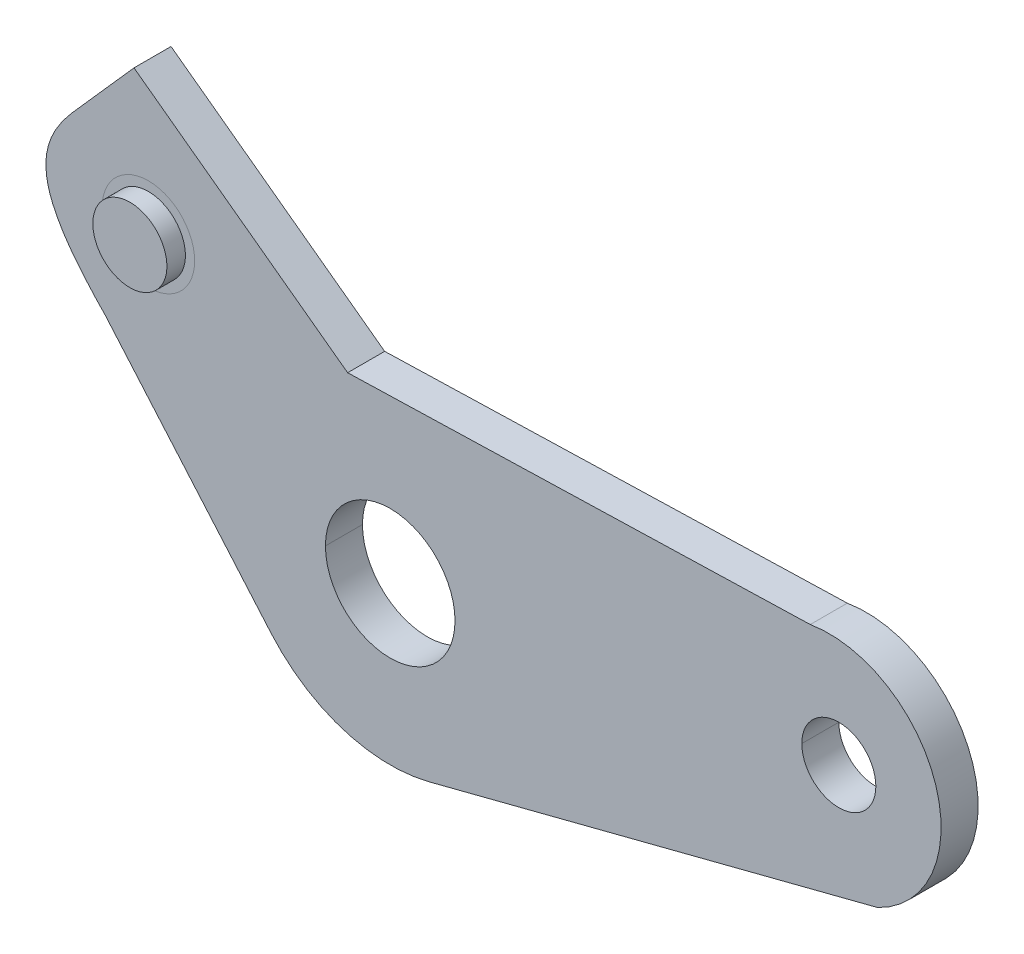
ISO-10303-21;
HEADER;
FILE_DESCRIPTION(('STEP AP214'),'2;1');
FILE_NAME('part.step','',(''),(''),'','','');
FILE_SCHEMA(('AUTOMOTIVE_DESIGN { 1 0 10303 214 1 1 1 1 }'));
ENDSEC;
DATA;
#1=APPLICATION_CONTEXT('core data for automotive mechanical design processes');
#2=APPLICATION_PROTOCOL_DEFINITION('international standard','automotive_design',2000,#1);
#3=PRODUCT_CONTEXT('',#1,'mechanical');
#4=PRODUCT('Part','Part','',(#3));
#5=PRODUCT_RELATED_PRODUCT_CATEGORY('part','',(#4));
#6=PRODUCT_DEFINITION_FORMATION('','',#4);
#7=PRODUCT_DEFINITION_CONTEXT('part definition',#1,'design');
#8=PRODUCT_DEFINITION('design','',#6,#7);
#9=PRODUCT_DEFINITION_SHAPE('','',#8);
#10=(LENGTH_UNIT() NAMED_UNIT(*) SI_UNIT(.MILLI.,.METRE.));
#11=(NAMED_UNIT(*) PLANE_ANGLE_UNIT() SI_UNIT($,.RADIAN.));
#12=(NAMED_UNIT(*) SI_UNIT($,.STERADIAN.) SOLID_ANGLE_UNIT());
#13=UNCERTAINTY_MEASURE_WITH_UNIT(LENGTH_MEASURE(1.E-05),#10,'distance_accuracy_value','');
#14=(GEOMETRIC_REPRESENTATION_CONTEXT(3) GLOBAL_UNCERTAINTY_ASSIGNED_CONTEXT((#13)) GLOBAL_UNIT_ASSIGNED_CONTEXT((#10,
#11,#12)) REPRESENTATION_CONTEXT('',''));
#15=CARTESIAN_POINT('',(0.,0.,0.));
#16=DIRECTION('',(0.,0.,1.));
#17=DIRECTION('',(1.,0.,0.));
#18=AXIS2_PLACEMENT_3D('',#15,#16,#17);
#19=CARTESIAN_POINT('',(-4.59610422628045,7.63971387845278,-2.));
#20=DIRECTION('',(0.,0.,1.));
#21=DIRECTION('',(1.,0.,0.));
#22=AXIS2_PLACEMENT_3D('',#19,#20,#21);
#23=PLANE('',#22);
#24=CARTESIAN_POINT('',(-4.59610422628045,7.63971387845278,-2.));
#25=DIRECTION('',(0.,0.,1.));
#26=DIRECTION('',(1.,0.,0.));
#27=AXIS2_PLACEMENT_3D('',#24,#25,#26);
#28=CIRCLE('',#27,2.5);
#29=CARTESIAN_POINT('',(-7.09610422628045,7.63971387845278,-2.));
#30=VERTEX_POINT('',#29);
#31=CARTESIAN_POINT('',(-2.09610422628045,7.63971387845278,-2.));
#32=VERTEX_POINT('',#31);
#33=EDGE_CURVE('P0_E54',#30,#32,#28,.T.);
#34=ORIENTED_EDGE('',*,*,#33,.F.);
#35=CARTESIAN_POINT('',(-4.59610422628045,7.63971387845278,-2.));
#36=DIRECTION('',(0.,0.,1.));
#37=DIRECTION('',(1.,0.,0.));
#38=AXIS2_PLACEMENT_3D('',#35,#36,#37);
#39=CIRCLE('',#38,2.5);
#40=EDGE_CURVE('P0_E86',#32,#30,#39,.T.);
#41=ORIENTED_EDGE('',*,*,#40,.F.);
#42=EDGE_LOOP('',(#34,#41));
#43=FACE_BOUND('',#42,.T.);
#44=ADVANCED_FACE('P0_F45',(#43),#23,.F.);
#45=CARTESIAN_POINT('',(-4.59610422628045,7.63971387845278,3.));
#46=DIRECTION('',(0.,0.,-1.));
#47=DIRECTION('',(-1.,0.,0.));
#48=AXIS2_PLACEMENT_3D('',#45,#46,#47);
#49=CYLINDRICAL_SURFACE('',#48,2.5);
#50=CARTESIAN_POINT('',(-4.59610422628045,7.63971387845278,2.));
#51=DIRECTION('',(0.,0.,-1.));
#52=DIRECTION('',(-1.,0.,0.));
#53=AXIS2_PLACEMENT_3D('',#50,#51,#52);
#54=CIRCLE('',#53,2.5);
#55=CARTESIAN_POINT('',(-7.09610422628045,7.63971387845278,2.));
#56=VERTEX_POINT('',#55);
#57=CARTESIAN_POINT('',(-2.09610422628045,7.63971387845278,2.));
#58=VERTEX_POINT('',#57);
#59=EDGE_CURVE('P0_E59',#56,#58,#54,.F.);
#60=ORIENTED_EDGE('',*,*,#59,.F.);
#61=DIRECTION('',(0.,0.,-1.));
#62=VECTOR('',#61,1.);
#63=CARTESIAN_POINT('',(-7.09610422628045,7.63971387845278,3.));
#64=LINE('',#63,#62);
#65=EDGE_CURVE('P0_E69',#56,#30,#64,.T.);
#66=ORIENTED_EDGE('',*,*,#65,.T.);
#67=ORIENTED_EDGE('',*,*,#33,.T.);
#68=DIRECTION('',(0.,0.,-1.));
#69=VECTOR('',#68,1.);
#70=CARTESIAN_POINT('',(-2.09610422628045,7.63971387845278,3.));
#71=LINE('',#70,#69);
#72=EDGE_CURVE('P0_E79',#58,#32,#71,.T.);
#73=ORIENTED_EDGE('',*,*,#72,.F.);
#74=EDGE_LOOP('',(#60,#66,#67,#73));
#75=FACE_BOUND('',#74,.T.);
#76=ADVANCED_FACE('P0_F47',(#75),#49,.T.);
#77=CARTESIAN_POINT('',(-4.59610422628045,7.63971387845278,3.));
#78=DIRECTION('',(0.,0.,-1.));
#79=DIRECTION('',(-1.,0.,0.));
#80=AXIS2_PLACEMENT_3D('',#77,#78,#79);
#81=CYLINDRICAL_SURFACE('',#80,2.5);
#82=CARTESIAN_POINT('',(-4.59610422628045,7.63971387845278,2.));
#83=DIRECTION('',(0.,0.,-1.));
#84=DIRECTION('',(-1.,0.,0.));
#85=AXIS2_PLACEMENT_3D('',#82,#83,#84);
#86=CIRCLE('',#85,2.5);
#87=EDGE_CURVE('P0_E11',#58,#56,#86,.F.);
#88=ORIENTED_EDGE('',*,*,#87,.F.);
#89=ORIENTED_EDGE('',*,*,#72,.T.);
#90=ORIENTED_EDGE('',*,*,#40,.T.);
#91=ORIENTED_EDGE('',*,*,#65,.F.);
#92=EDGE_LOOP('',(#88,#89,#90,#91));
#93=FACE_BOUND('',#92,.T.);
#94=ADVANCED_FACE('P0_F84',(#93),#81,.T.);
#95=CARTESIAN_POINT('',(-4.59610422628045,7.63971387845278,-7.59838450677923));
#96=DIRECTION('',(0.,0.,1.));
#97=DIRECTION('',(1.,0.,0.));
#98=AXIS2_PLACEMENT_3D('',#95,#96,#97);
#99=CYLINDRICAL_SURFACE('',#98,2.);
#100=CARTESIAN_POINT('',(-4.59610422628045,7.63971387845278,3.));
#101=DIRECTION('',(0.,0.,-1.));
#102=DIRECTION('',(-1.,0.,0.));
#103=AXIS2_PLACEMENT_3D('',#100,#101,#102);
#104=CIRCLE('',#103,2.);
#105=CARTESIAN_POINT('',(-6.59610422628045,7.63971387845278,3.));
#106=VERTEX_POINT('',#105);
#107=EDGE_CURVE('P0_E81',#106,#106,#104,.T.);
#108=ORIENTED_EDGE('',*,*,#107,.T.);
#109=EDGE_LOOP('',(#108));
#110=FACE_BOUND('',#109,.T.);
#111=CARTESIAN_POINT('',(-4.59610422628045,7.63971387845278,2.));
#112=DIRECTION('',(0.,0.,-1.));
#113=DIRECTION('',(-1.,0.,0.));
#114=AXIS2_PLACEMENT_3D('',#111,#112,#113);
#115=CIRCLE('',#114,2.);
#116=CARTESIAN_POINT('',(-6.59610422628045,7.63971387845278,2.));
#117=VERTEX_POINT('',#116);
#118=EDGE_CURVE('P0_E97',#117,#117,#115,.T.);
#119=ORIENTED_EDGE('',*,*,#118,.F.);
#120=EDGE_LOOP('',(#119));
#121=FACE_BOUND('',#120,.T.);
#122=ADVANCED_FACE('P0_F105',(#110,#121),#99,.T.);
#123=CARTESIAN_POINT('',(-10.0151184548294,7.22603500592955,2.));
#124=DIRECTION('',(0.,0.,-1.));
#125=DIRECTION('',(0.,-1.,0.));
#126=AXIS2_PLACEMENT_3D('',#123,#124,#125);
#127=PLANE('',#126);
#128=ORIENTED_EDGE('',*,*,#59,.T.);
#129=ORIENTED_EDGE('',*,*,#87,.T.);
#130=EDGE_LOOP('',(#128,#129));
#131=FACE_BOUND('',#130,.T.);
#132=ORIENTED_EDGE('',*,*,#118,.T.);
#133=EDGE_LOOP('',(#132));
#134=FACE_BOUND('',#133,.T.);
#135=ADVANCED_FACE('P0_F75',(#131,#134),#127,.F.);
#136=CARTESIAN_POINT('',(-4.59610422628045,7.63971387845278,3.));
#137=DIRECTION('',(0.,0.,1.));
#138=DIRECTION('',(1.,0.,0.));
#139=AXIS2_PLACEMENT_3D('',#136,#137,#138);
#140=PLANE('',#139);
#141=ORIENTED_EDGE('',*,*,#107,.F.);
#142=EDGE_LOOP('',(#141));
#143=FACE_BOUND('',#142,.T.);
#144=ADVANCED_FACE('P0_F108',(#143),#140,.T.);
#145=CLOSED_SHELL('',(#44,#76,#94,#122,#135,#144));
#146=MANIFOLD_SOLID_BREP('P0_B2',#145);
#147=CARTESIAN_POINT('',(-4.59610422628045,7.63971387845278,2.));
#148=DIRECTION('',(0.,0.,-1.));
#149=DIRECTION('',(-1.,0.,0.));
#150=AXIS2_PLACEMENT_3D('',#147,#148,#149);
#151=CYLINDRICAL_SURFACE('',#150,2.5);
#152=DIRECTION('',(0.,0.,-1.));
#153=VECTOR('',#152,1.);
#154=CARTESIAN_POINT('',(-2.09610422628045,7.63971387845278,2.));
#155=LINE('',#154,#153);
#156=CARTESIAN_POINT('',(-2.09610422628045,7.63971387845278,2.));
#157=VERTEX_POINT('',#156);
#158=CARTESIAN_POINT('',(-2.09610422628045,7.63971387845278,0.));
#159=VERTEX_POINT('',#158);
#160=EDGE_CURVE('P1_E277',#157,#159,#155,.T.);
#161=ORIENTED_EDGE('',*,*,#160,.F.);
#162=CARTESIAN_POINT('',(-4.59610422628045,7.63971387845278,2.));
#163=DIRECTION('',(0.,0.,1.));
#164=DIRECTION('',(1.,0.,0.));
#165=AXIS2_PLACEMENT_3D('',#162,#163,#164);
#166=CIRCLE('',#165,2.5);
#167=CARTESIAN_POINT('',(-7.09610422628045,7.63971387845278,2.));
#168=VERTEX_POINT('',#167);
#169=EDGE_CURVE('P1_E229',#157,#168,#166,.T.);
#170=ORIENTED_EDGE('',*,*,#169,.T.);
#171=DIRECTION('',(0.,0.,-1.));
#172=VECTOR('',#171,1.);
#173=CARTESIAN_POINT('',(-7.09610422628045,7.63971387845278,2.));
#174=LINE('',#173,#172);
#175=CARTESIAN_POINT('',(-7.09610422628045,7.63971387845278,0.));
#176=VERTEX_POINT('',#175);
#177=EDGE_CURVE('P1_E276',#168,#176,#174,.T.);
#178=ORIENTED_EDGE('',*,*,#177,.T.);
#179=CARTESIAN_POINT('',(-4.59610422628045,7.63971387845278,0.));
#180=DIRECTION('',(0.,0.,1.));
#181=DIRECTION('',(1.,0.,0.));
#182=AXIS2_PLACEMENT_3D('',#179,#180,#181);
#183=CIRCLE('',#182,2.5);
#184=EDGE_CURVE('P1_E269',#159,#176,#183,.T.);
#185=ORIENTED_EDGE('',*,*,#184,.F.);
#186=EDGE_LOOP('',(#161,#170,#178,#185));
#187=FACE_BOUND('',#186,.T.);
#188=ADVANCED_FACE('P1_F16',(#187),#151,.F.);
#189=CARTESIAN_POINT('',(8.46825121049389,-2.15939244083325,2.));
#190=DIRECTION('',(0.,0.,-1.));
#191=DIRECTION('',(-1.,0.,0.));
#192=AXIS2_PLACEMENT_3D('',#189,#190,#191);
#193=CYLINDRICAL_SURFACE('',#192,3.5);
#194=DIRECTION('',(0.,0.,-1.));
#195=VECTOR('',#194,1.);
#196=CARTESIAN_POINT('',(11.9682512104939,-2.15939244083325,2.));
#197=LINE('',#196,#195);
#198=CARTESIAN_POINT('',(11.9682512104939,-2.15939244083325,2.));
#199=VERTEX_POINT('',#198);
#200=CARTESIAN_POINT('',(11.9682512104939,-2.15939244083325,0.));
#201=VERTEX_POINT('',#200);
#202=EDGE_CURVE('P1_E197',#199,#201,#197,.T.);
#203=ORIENTED_EDGE('',*,*,#202,.F.);
#204=CARTESIAN_POINT('',(8.46825121049389,-2.15939244083325,2.));
#205=DIRECTION('',(0.,0.,1.));
#206=DIRECTION('',(1.,0.,0.));
#207=AXIS2_PLACEMENT_3D('',#204,#205,#206);
#208=CIRCLE('',#207,3.5);
#209=CARTESIAN_POINT('',(4.96825121049389,-2.15939244083325,2.));
#210=VERTEX_POINT('',#209);
#211=EDGE_CURVE('P1_E236',#199,#210,#208,.T.);
#212=ORIENTED_EDGE('',*,*,#211,.T.);
#213=DIRECTION('',(0.,0.,-1.));
#214=VECTOR('',#213,1.);
#215=CARTESIAN_POINT('',(4.9682512104939,-2.15939244083325,2.));
#216=LINE('',#215,#214);
#217=CARTESIAN_POINT('',(4.96825121049389,-2.15939244083325,0.));
#218=VERTEX_POINT('',#217);
#219=EDGE_CURVE('P1_E196',#210,#218,#216,.T.);
#220=ORIENTED_EDGE('',*,*,#219,.T.);
#221=CARTESIAN_POINT('',(8.46825121049389,-2.15939244083325,0.));
#222=DIRECTION('',(0.,0.,1.));
#223=DIRECTION('',(1.,0.,0.));
#224=AXIS2_PLACEMENT_3D('',#221,#222,#223);
#225=CIRCLE('',#224,3.5);
#226=EDGE_CURVE('P1_E204',#201,#218,#225,.T.);
#227=ORIENTED_EDGE('',*,*,#226,.F.);
#228=EDGE_LOOP('',(#203,#212,#220,#227));
#229=FACE_BOUND('',#228,.T.);
#230=ADVANCED_FACE('P1_F351',(#229),#193,.F.);
#231=CARTESIAN_POINT('',(32.6996319505323,1.4586439646349,2.));
#232=DIRECTION('',(0.,0.,-1.));
#233=DIRECTION('',(-1.,0.,0.));
#234=AXIS2_PLACEMENT_3D('',#231,#232,#233);
#235=CYLINDRICAL_SURFACE('',#234,2.);
#236=DIRECTION('',(0.,0.,-1.));
#237=VECTOR('',#236,1.);
#238=CARTESIAN_POINT('',(34.6996319505323,1.4586439646349,2.));
#239=LINE('',#238,#237);
#240=CARTESIAN_POINT('',(34.6996319505323,1.4586439646349,2.));
#241=VERTEX_POINT('',#240);
#242=CARTESIAN_POINT('',(34.6996319505323,1.4586439646349,0.));
#243=VERTEX_POINT('',#242);
#244=EDGE_CURVE('P1_E242',#241,#243,#239,.T.);
#245=ORIENTED_EDGE('',*,*,#244,.F.);
#246=CARTESIAN_POINT('',(32.6996319505323,1.4586439646349,2.));
#247=DIRECTION('',(0.,0.,1.));
#248=DIRECTION('',(1.,0.,0.));
#249=AXIS2_PLACEMENT_3D('',#246,#247,#248);
#250=CIRCLE('',#249,2.);
#251=CARTESIAN_POINT('',(30.6996319505323,1.4586439646349,2.));
#252=VERTEX_POINT('',#251);
#253=EDGE_CURVE('P1_E254',#241,#252,#250,.T.);
#254=ORIENTED_EDGE('',*,*,#253,.T.);
#255=DIRECTION('',(0.,0.,-1.));
#256=VECTOR('',#255,1.);
#257=CARTESIAN_POINT('',(30.6996319505323,1.4586439646349,2.));
#258=LINE('',#257,#256);
#259=CARTESIAN_POINT('',(30.6996319505323,1.4586439646349,0.));
#260=VERTEX_POINT('',#259);
#261=EDGE_CURVE('P1_E198',#252,#260,#258,.T.);
#262=ORIENTED_EDGE('',*,*,#261,.T.);
#263=CARTESIAN_POINT('',(32.6996319505323,1.4586439646349,0.));
#264=DIRECTION('',(0.,0.,1.));
#265=DIRECTION('',(1.,0.,0.));
#266=AXIS2_PLACEMENT_3D('',#263,#264,#265);
#267=CIRCLE('',#266,2.);
#268=EDGE_CURVE('P1_E207',#243,#260,#267,.T.);
#269=ORIENTED_EDGE('',*,*,#268,.F.);
#270=EDGE_LOOP('',(#245,#254,#262,#269));
#271=FACE_BOUND('',#270,.T.);
#272=ADVANCED_FACE('P1_F373',(#271),#235,.F.);
#273=CARTESIAN_POINT('',(6.16762100389155,6.5415902997811,2.));
#274=DIRECTION('',(0.0286182176784376,-0.999590414928489,0.));
#275=DIRECTION('',(0.,0.,-1.));
#276=AXIS2_PLACEMENT_3D('',#273,#274,#275);
#277=PLANE('',#276);
#278=DIRECTION('',(-0.999590414928489,-0.0286182176784376,0.));
#279=VECTOR('',#278,1.);
#280=CARTESIAN_POINT('',(6.16762100389155,6.5415902997811,0.));
#281=LINE('',#280,#279);
#282=CARTESIAN_POINT('',(31.1573813771038,7.25704574174204,0.));
#283=VERTEX_POINT('',#282);
#284=CARTESIAN_POINT('',(6.16762100389155,6.5415902997811,0.));
#285=VERTEX_POINT('',#284);
#286=EDGE_CURVE('P1_E187',#283,#285,#281,.T.);
#287=ORIENTED_EDGE('',*,*,#286,.T.);
#288=DIRECTION('',(0.,0.,-1.));
#289=VECTOR('',#288,1.);
#290=CARTESIAN_POINT('',(6.16762100389155,6.5415902997811,2.));
#291=LINE('',#290,#289);
#292=CARTESIAN_POINT('',(6.16762100389155,6.5415902997811,2.));
#293=VERTEX_POINT('',#292);
#294=EDGE_CURVE('P1_E223',#293,#285,#291,.T.);
#295=ORIENTED_EDGE('',*,*,#294,.F.);
#296=DIRECTION('',(-0.999590414928489,-0.0286182176784376,0.));
#297=VECTOR('',#296,1.);
#298=CARTESIAN_POINT('',(6.16762100389155,6.5415902997811,2.));
#299=LINE('',#298,#297);
#300=CARTESIAN_POINT('',(31.1573813771038,7.25704574174204,2.));
#301=VERTEX_POINT('',#300);
#302=EDGE_CURVE('P1_E250',#301,#293,#299,.T.);
#303=ORIENTED_EDGE('',*,*,#302,.F.);
#304=DIRECTION('',(0.,0.,-1.));
#305=VECTOR('',#304,1.);
#306=CARTESIAN_POINT('',(31.1573813771038,7.25704574174204,2.));
#307=LINE('',#306,#305);
#308=EDGE_CURVE('P1_E11',#301,#283,#307,.T.);
#309=ORIENTED_EDGE('',*,*,#308,.T.);
#310=EDGE_LOOP('',(#287,#295,#303,#309));
#311=FACE_BOUND('',#310,.T.);
#312=ADVANCED_FACE('P1_F383',(#311),#277,.F.);
#313=CARTESIAN_POINT('',(32.1739587121461,1.29140647641995,2.));
#314=DIRECTION('',(0.,0.,-1.));
#315=DIRECTION('',(-1.,0.,0.));
#316=AXIS2_PLACEMENT_3D('',#313,#314,#315);
#317=CYLINDRICAL_SURFACE('',#316,6.05163459918677);
#318=CARTESIAN_POINT('',(32.1739587121461,1.29140647641995,0.));
#319=DIRECTION('',(0.,0.,1.));
#320=DIRECTION('',(1.,0.,0.));
#321=AXIS2_PLACEMENT_3D('',#318,#319,#320);
#322=CIRCLE('',#321,6.05163459918677);
#323=CARTESIAN_POINT('',(34.7911874384884,-4.16500215161396,0.));
#324=VERTEX_POINT('',#323);
#325=EDGE_CURVE('P1_E180',#324,#283,#322,.T.);
#326=ORIENTED_EDGE('',*,*,#325,.T.);
#327=ORIENTED_EDGE('',*,*,#308,.F.);
#328=CARTESIAN_POINT('',(32.1739587121461,1.29140647641995,2.));
#329=DIRECTION('',(0.,0.,1.));
#330=DIRECTION('',(1.,0.,0.));
#331=AXIS2_PLACEMENT_3D('',#328,#329,#330);
#332=CIRCLE('',#331,6.05163459918677);
#333=CARTESIAN_POINT('',(34.7911874384884,-4.16500215161396,2.));
#334=VERTEX_POINT('',#333);
#335=EDGE_CURVE('P1_E255',#334,#301,#332,.T.);
#336=ORIENTED_EDGE('',*,*,#335,.F.);
#337=DIRECTION('',(0.,0.,-1.));
#338=VECTOR('',#337,1.);
#339=CARTESIAN_POINT('',(34.7911874384884,-4.16500215161396,2.));
#340=LINE('',#339,#338);
#341=EDGE_CURVE('P1_E27',#334,#324,#340,.T.);
#342=ORIENTED_EDGE('',*,*,#341,.T.);
#343=EDGE_LOOP('',(#326,#327,#336,#342));
#344=FACE_BOUND('',#343,.T.);
#345=ADVANCED_FACE('P1_F387',(#344),#317,.T.);
#346=CARTESIAN_POINT('',(10.579384133933,-10.3930500593872,2.));
#347=DIRECTION('',(-0.24912191631093,0.968472132182217,0.));
#348=DIRECTION('',(0.,0.,1.));
#349=AXIS2_PLACEMENT_3D('',#346,#347,#348);
#350=PLANE('',#349);
#351=DIRECTION('',(0.968472132182217,0.24912191631093,0.));
#352=VECTOR('',#351,1.);
#353=CARTESIAN_POINT('',(10.579384133933,-10.3930500593872,0.));
#354=LINE('',#353,#352);
#355=CARTESIAN_POINT('',(10.579384133933,-10.3930500593872,0.));
#356=VERTEX_POINT('',#355);
#357=EDGE_CURVE('P1_E159',#356,#324,#354,.T.);
#358=ORIENTED_EDGE('',*,*,#357,.T.);
#359=ORIENTED_EDGE('',*,*,#341,.F.);
#360=DIRECTION('',(0.968472132182217,0.24912191631093,0.));
#361=VECTOR('',#360,1.);
#362=CARTESIAN_POINT('',(10.579384133933,-10.3930500593872,2.));
#363=LINE('',#362,#361);
#364=CARTESIAN_POINT('',(10.579384133933,-10.3930500593872,2.));
#365=VERTEX_POINT('',#364);
#366=EDGE_CURVE('P1_E162',#365,#334,#363,.T.);
#367=ORIENTED_EDGE('',*,*,#366,.F.);
#368=DIRECTION('',(0.,0.,-1.));
#369=VECTOR('',#368,1.);
#370=CARTESIAN_POINT('',(10.579384133933,-10.3930500593872,2.));
#371=LINE('',#370,#369);
#372=EDGE_CURVE('P1_E135',#365,#356,#371,.T.);
#373=ORIENTED_EDGE('',*,*,#372,.T.);
#374=EDGE_LOOP('',(#358,#359,#367,#373));
#375=FACE_BOUND('',#374,.T.);
#376=ADVANCED_FACE('P1_F157',(#375),#350,.F.);
#377=CARTESIAN_POINT('',(8.46825121049389,-2.15939244083325,2.));
#378=DIRECTION('',(0.,0.,-1.));
#379=DIRECTION('',(-1.,0.,0.));
#380=AXIS2_PLACEMENT_3D('',#377,#378,#379);
#381=CYLINDRICAL_SURFACE('',#380,8.5);
#382=CARTESIAN_POINT('',(8.46825121049389,-2.15939244083325,0.));
#383=DIRECTION('',(0.,0.,1.));
#384=DIRECTION('',(1.,0.,0.));
#385=AXIS2_PLACEMENT_3D('',#382,#383,#384);
#386=CIRCLE('',#385,8.5);
#387=CARTESIAN_POINT('',(2.02872096604568,-7.70758586129336,0.));
#388=VERTEX_POINT('',#387);
#389=EDGE_CURVE('P1_E168',#388,#356,#386,.T.);
#390=ORIENTED_EDGE('',*,*,#389,.T.);
#391=ORIENTED_EDGE('',*,*,#372,.F.);
#392=CARTESIAN_POINT('',(8.46825121049389,-2.15939244083325,2.));
#393=DIRECTION('',(0.,0.,1.));
#394=DIRECTION('',(1.,0.,0.));
#395=AXIS2_PLACEMENT_3D('',#392,#393,#394);
#396=CIRCLE('',#395,8.5);
#397=CARTESIAN_POINT('',(2.02872096604568,-7.70758586129336,2.));
#398=VERTEX_POINT('',#397);
#399=EDGE_CURVE('P1_E261',#398,#365,#396,.T.);
#400=ORIENTED_EDGE('',*,*,#399,.F.);
#401=DIRECTION('',(0.,0.,-1.));
#402=VECTOR('',#401,1.);
#403=CARTESIAN_POINT('',(2.02872096604568,-7.70758586129336,2.));
#404=LINE('',#403,#402);
#405=EDGE_CURVE('P1_E165',#398,#388,#404,.T.);
#406=ORIENTED_EDGE('',*,*,#405,.T.);
#407=EDGE_LOOP('',(#390,#391,#400,#406));
#408=FACE_BOUND('',#407,.T.);
#409=ADVANCED_FACE('P1_F169',(#408),#381,.T.);
#410=CARTESIAN_POINT('',(2.02872096604568,-7.70758586129336,2.));
#411=DIRECTION('',(0.757591793464495,0.652728637701189,0.));
#412=DIRECTION('',(0.,0.,-1.));
#413=AXIS2_PLACEMENT_3D('',#410,#411,#412);
#414=PLANE('',#413);
#415=DIRECTION('',(0.652728637701189,-0.757591793464495,0.));
#416=VECTOR('',#415,1.);
#417=CARTESIAN_POINT('',(2.02872096604568,-7.70758586129336,0.));
#418=LINE('',#417,#416);
#419=CARTESIAN_POINT('',(-6.91192734898659,2.66940911103599,0.));
#420=VERTEX_POINT('',#419);
#421=EDGE_CURVE('P1_E174',#420,#388,#418,.T.);
#422=ORIENTED_EDGE('',*,*,#421,.T.);
#423=ORIENTED_EDGE('',*,*,#405,.F.);
#424=DIRECTION('',(0.652728637701189,-0.757591793464495,0.));
#425=VECTOR('',#424,1.);
#426=CARTESIAN_POINT('',(2.02872096604568,-7.70758586129336,2.));
#427=LINE('',#426,#425);
#428=CARTESIAN_POINT('',(-6.91192734898659,2.66940911103599,2.));
#429=VERTEX_POINT('',#428);
#430=EDGE_CURVE('P1_E215',#429,#398,#427,.T.);
#431=ORIENTED_EDGE('',*,*,#430,.F.);
#432=DIRECTION('',(0.,0.,-1.));
#433=VECTOR('',#432,1.);
#434=CARTESIAN_POINT('',(-6.91192734898659,2.66940911103599,2.));
#435=LINE('',#434,#433);
#436=EDGE_CURVE('P1_E222',#429,#420,#435,.T.);
#437=ORIENTED_EDGE('',*,*,#436,.T.);
#438=EDGE_LOOP('',(#422,#423,#431,#437));
#439=FACE_BOUND('',#438,.T.);
#440=ADVANCED_FACE('P1_F18',(#439),#414,.F.);
#441=CARTESIAN_POINT('',(-8.7331493238679,11.2385781544702,2.));
#442=CARTESIAN_POINT('',(-8.7331493238679,11.2385781544702,0.));
#443=CARTESIAN_POINT('',(-11.1779944539251,8.45463783183816,2.));
#444=CARTESIAN_POINT('',(-11.1779944539251,8.45463783183816,0.));
#445=CARTESIAN_POINT('',(-10.3139625346686,6.17879309547191,2.));
#446=CARTESIAN_POINT('',(-10.3139625346686,6.17879309547191,0.));
#447=CARTESIAN_POINT('',(-6.91192734898658,2.66940911103598,2.));
#448=CARTESIAN_POINT('',(-6.91192734898658,2.66940911103598,0.));
#449=(BOUNDED_SURFACE() B_SPLINE_SURFACE(3,1,((#441,#442),(#443,#444),(#445,#446),(#447,#448)),
.UNSPECIFIED.,.F.,.F.,.F.) B_SPLINE_SURFACE_WITH_KNOTS((4,4),(2,2),(0.,1.),(0.,1.),
.UNSPECIFIED.) GEOMETRIC_REPRESENTATION_ITEM() RATIONAL_B_SPLINE_SURFACE(((1.,1.),(1.,1.),(1.,
1.),(1.,1.))) REPRESENTATION_ITEM('') SURFACE());
#450=CARTESIAN_POINT('',(-8.7331493238679,11.2385781544702,0.));
#451=CARTESIAN_POINT('',(-11.1779944539251,8.45463783183816,0.));
#452=CARTESIAN_POINT('',(-10.3139625346686,6.17879309547191,0.));
#453=CARTESIAN_POINT('',(-6.91192734898659,2.66940911103599,0.));
#454=(BOUNDED_CURVE() B_SPLINE_CURVE(3,(#450,#451,#452,#453),.UNSPECIFIED.,.F.,
.F.) B_SPLINE_CURVE_WITH_KNOTS((4,4),(0.,1.),
.UNSPECIFIED.) CURVE() GEOMETRIC_REPRESENTATION_ITEM() RATIONAL_B_SPLINE_CURVE((1.,1.,1.,1.)) REPRESENTATION_ITEM(''));
#455=CARTESIAN_POINT('',(-8.7331493238679,11.2385781544702,0.));
#456=VERTEX_POINT('',#455);
#457=EDGE_CURVE('P1_E224',#456,#420,#454,.T.);
#458=CARTESIAN_POINT('',(-8.7331493238679,11.2385781544702,2.));
#459=CARTESIAN_POINT('',(-11.1779944539251,8.45463783183816,2.));
#460=CARTESIAN_POINT('',(-10.3139625346686,6.17879309547191,2.));
#461=CARTESIAN_POINT('',(-6.91192734898659,2.66940911103599,2.));
#462=(BOUNDED_CURVE() B_SPLINE_CURVE(3,(#458,#459,#460,#461),.UNSPECIFIED.,.F.,
.F.) B_SPLINE_CURVE_WITH_KNOTS((4,4),(0.,1.),
.UNSPECIFIED.) CURVE() GEOMETRIC_REPRESENTATION_ITEM() RATIONAL_B_SPLINE_CURVE((1.,1.,1.,1.)) REPRESENTATION_ITEM(''));
#463=CARTESIAN_POINT('',(-8.7331493238679,11.2385781544702,2.));
#464=VERTEX_POINT('',#463);
#465=EDGE_CURVE('P1_E209',#464,#429,#462,.T.);
#466=DIRECTION('',(0.,0.,-1.));
#467=VECTOR('',#466,1.);
#468=CARTESIAN_POINT('',(-8.7331493238679,11.2385781544702,2.));
#469=LINE('',#468,#467);
#470=EDGE_CURVE('P1_E42',#464,#456,#469,.T.);
#471=ORIENTED_EDGE('',*,*,#457,.T.);
#472=ORIENTED_EDGE('',*,*,#436,.F.);
#473=ORIENTED_EDGE('',*,*,#465,.F.);
#474=ORIENTED_EDGE('',*,*,#470,.T.);
#475=EDGE_LOOP('',(#471,#472,#473,#474));
#476=FACE_BOUND('',#475,.T.);
#477=ADVANCED_FACE('P1_F291',(#476),#449,.F.);
#478=CARTESIAN_POINT('',(-5.37214344226468,15.0333709086521,2.));
#479=DIRECTION('',(0.748597606378919,-0.663024602653441,0.));
#480=DIRECTION('',(0.,0.,-1.));
#481=AXIS2_PLACEMENT_3D('',#478,#479,#480);
#482=PLANE('',#481);
#483=DIRECTION('',(-0.663024602653441,-0.748597606378919,0.));
#484=VECTOR('',#483,1.);
#485=CARTESIAN_POINT('',(-5.37214344226468,15.0333709086521,0.));
#486=LINE('',#485,#484);
#487=CARTESIAN_POINT('',(-5.37214344226468,15.0333709086521,0.));
#488=VERTEX_POINT('',#487);
#489=EDGE_CURVE('P1_E208',#488,#456,#486,.T.);
#490=ORIENTED_EDGE('',*,*,#489,.T.);
#491=ORIENTED_EDGE('',*,*,#470,.F.);
#492=DIRECTION('',(-0.663024602653441,-0.748597606378919,0.));
#493=VECTOR('',#492,1.);
#494=CARTESIAN_POINT('',(-5.37214344226468,15.0333709086521,2.));
#495=LINE('',#494,#493);
#496=CARTESIAN_POINT('',(-5.37214344226468,15.0333709086521,2.));
#497=VERTEX_POINT('',#496);
#498=EDGE_CURVE('P1_E216',#497,#464,#495,.T.);
#499=ORIENTED_EDGE('',*,*,#498,.F.);
#500=DIRECTION('',(0.,0.,-1.));
#501=VECTOR('',#500,1.);
#502=CARTESIAN_POINT('',(-5.37214344226468,15.0333709086521,2.));
#503=LINE('',#502,#501);
#504=EDGE_CURVE('P1_E266',#497,#488,#503,.T.);
#505=ORIENTED_EDGE('',*,*,#504,.T.);
#506=EDGE_LOOP('',(#490,#491,#499,#505));
#507=FACE_BOUND('',#506,.T.);
#508=ADVANCED_FACE('P1_F295',(#507),#482,.F.);
#509=CARTESIAN_POINT('',(6.16762100389155,6.5415902997811,2.));
#510=DIRECTION('',(-0.59269211114063,-0.805429116304882,0.));
#511=DIRECTION('',(-0.805429116304882,0.59269211114063,0.));
#512=AXIS2_PLACEMENT_3D('',#509,#510,#511);
#513=PLANE('',#512);
#514=DIRECTION('',(-0.805429116304882,0.59269211114063,0.));
#515=VECTOR('',#514,1.);
#516=CARTESIAN_POINT('',(6.16762100389155,6.5415902997811,0.));
#517=LINE('',#516,#515);
#518=EDGE_CURVE('P1_E235',#285,#488,#517,.T.);
#519=ORIENTED_EDGE('',*,*,#518,.T.);
#520=ORIENTED_EDGE('',*,*,#504,.F.);
#521=DIRECTION('',(-0.805429116304882,0.59269211114063,0.));
#522=VECTOR('',#521,1.);
#523=CARTESIAN_POINT('',(6.16762100389155,6.5415902997811,2.));
#524=LINE('',#523,#522);
#525=EDGE_CURVE('P1_E202',#293,#497,#524,.T.);
#526=ORIENTED_EDGE('',*,*,#525,.F.);
#527=ORIENTED_EDGE('',*,*,#294,.T.);
#528=EDGE_LOOP('',(#519,#520,#526,#527));
#529=FACE_BOUND('',#528,.T.);
#530=ADVANCED_FACE('P1_F354',(#529),#513,.F.);
#531=CARTESIAN_POINT('',(-10.0151184548294,7.22603500592955,0.));
#532=DIRECTION('',(0.,0.,-1.));
#533=DIRECTION('',(0.,-1.,0.));
#534=AXIS2_PLACEMENT_3D('',#531,#532,#533);
#535=PLANE('',#534);
#536=CARTESIAN_POINT('',(-4.59610422628045,7.63971387845278,0.));
#537=DIRECTION('',(0.,0.,1.));
#538=DIRECTION('',(1.,0.,0.));
#539=AXIS2_PLACEMENT_3D('',#536,#537,#538);
#540=CIRCLE('',#539,2.5);
#541=EDGE_CURVE('P1_E272',#176,#159,#540,.T.);
#542=ORIENTED_EDGE('',*,*,#541,.T.);
#543=ORIENTED_EDGE('',*,*,#184,.T.);
#544=EDGE_LOOP('',(#542,#543));
#545=FACE_BOUND('',#544,.T.);
#546=CARTESIAN_POINT('',(32.6996319505323,1.4586439646349,0.));
#547=DIRECTION('',(0.,0.,1.));
#548=DIRECTION('',(1.,0.,0.));
#549=AXIS2_PLACEMENT_3D('',#546,#547,#548);
#550=CIRCLE('',#549,2.);
#551=EDGE_CURVE('P1_E203',#260,#243,#550,.T.);
#552=ORIENTED_EDGE('',*,*,#551,.T.);
#553=ORIENTED_EDGE('',*,*,#268,.T.);
#554=EDGE_LOOP('',(#552,#553));
#555=FACE_BOUND('',#554,.T.);
#556=CARTESIAN_POINT('',(8.46825121049389,-2.15939244083325,0.));
#557=DIRECTION('',(0.,0.,1.));
#558=DIRECTION('',(1.,0.,0.));
#559=AXIS2_PLACEMENT_3D('',#556,#557,#558);
#560=CIRCLE('',#559,3.5);
#561=EDGE_CURVE('P1_E192',#218,#201,#560,.T.);
#562=ORIENTED_EDGE('',*,*,#561,.T.);
#563=ORIENTED_EDGE('',*,*,#226,.T.);
#564=EDGE_LOOP('',(#562,#563));
#565=FACE_BOUND('',#564,.T.);
#566=ORIENTED_EDGE('',*,*,#518,.F.);
#567=ORIENTED_EDGE('',*,*,#286,.F.);
#568=ORIENTED_EDGE('',*,*,#325,.F.);
#569=ORIENTED_EDGE('',*,*,#357,.F.);
#570=ORIENTED_EDGE('',*,*,#389,.F.);
#571=ORIENTED_EDGE('',*,*,#421,.F.);
#572=ORIENTED_EDGE('',*,*,#457,.F.);
#573=ORIENTED_EDGE('',*,*,#489,.F.);
#574=EDGE_LOOP('',(#566,#567,#568,#569,#570,#571,#572,#573));
#575=FACE_BOUND('',#574,.T.);
#576=ADVANCED_FACE('P1_F177',(#545,#555,#565,#575),#535,.T.);
#577=CARTESIAN_POINT('',(-10.0151184548294,7.22603500592955,2.));
#578=DIRECTION('',(0.,0.,-1.));
#579=DIRECTION('',(0.,-1.,0.));
#580=AXIS2_PLACEMENT_3D('',#577,#578,#579);
#581=PLANE('',#580);
#582=CARTESIAN_POINT('',(-4.59610422628045,7.63971387845278,2.));
#583=DIRECTION('',(0.,0.,1.));
#584=DIRECTION('',(1.,0.,0.));
#585=AXIS2_PLACEMENT_3D('',#582,#583,#584);
#586=CIRCLE('',#585,2.5);
#587=EDGE_CURVE('P1_E308',#168,#157,#586,.T.);
#588=ORIENTED_EDGE('',*,*,#587,.F.);
#589=ORIENTED_EDGE('',*,*,#169,.F.);
#590=EDGE_LOOP('',(#588,#589));
#591=FACE_BOUND('',#590,.T.);
#592=CARTESIAN_POINT('',(8.46825121049389,-2.15939244083325,2.));
#593=DIRECTION('',(0.,0.,1.));
#594=DIRECTION('',(1.,0.,0.));
#595=AXIS2_PLACEMENT_3D('',#592,#593,#594);
#596=CIRCLE('',#595,3.5);
#597=EDGE_CURVE('P1_E249',#210,#199,#596,.T.);
#598=ORIENTED_EDGE('',*,*,#597,.F.);
#599=ORIENTED_EDGE('',*,*,#211,.F.);
#600=EDGE_LOOP('',(#598,#599));
#601=FACE_BOUND('',#600,.T.);
#602=CARTESIAN_POINT('',(32.6996319505323,1.4586439646349,2.));
#603=DIRECTION('',(0.,0.,1.));
#604=DIRECTION('',(1.,0.,0.));
#605=AXIS2_PLACEMENT_3D('',#602,#603,#604);
#606=CIRCLE('',#605,2.);
#607=EDGE_CURVE('P1_E20',#252,#241,#606,.T.);
#608=ORIENTED_EDGE('',*,*,#607,.F.);
#609=ORIENTED_EDGE('',*,*,#253,.F.);
#610=EDGE_LOOP('',(#608,#609));
#611=FACE_BOUND('',#610,.T.);
#612=ORIENTED_EDGE('',*,*,#525,.T.);
#613=ORIENTED_EDGE('',*,*,#498,.T.);
#614=ORIENTED_EDGE('',*,*,#465,.T.);
#615=ORIENTED_EDGE('',*,*,#430,.T.);
#616=ORIENTED_EDGE('',*,*,#399,.T.);
#617=ORIENTED_EDGE('',*,*,#366,.T.);
#618=ORIENTED_EDGE('',*,*,#335,.T.);
#619=ORIENTED_EDGE('',*,*,#302,.T.);
#620=EDGE_LOOP('',(#612,#613,#614,#615,#616,#617,#618,#619));
#621=FACE_BOUND('',#620,.T.);
#622=ADVANCED_FACE('P1_F286',(#591,#601,#611,#621),#581,.F.);
#623=CARTESIAN_POINT('',(32.6996319505323,1.4586439646349,2.));
#624=DIRECTION('',(0.,0.,-1.));
#625=DIRECTION('',(-1.,0.,0.));
#626=AXIS2_PLACEMENT_3D('',#623,#624,#625);
#627=CYLINDRICAL_SURFACE('',#626,2.);
#628=ORIENTED_EDGE('',*,*,#607,.T.);
#629=ORIENTED_EDGE('',*,*,#244,.T.);
#630=ORIENTED_EDGE('',*,*,#551,.F.);
#631=ORIENTED_EDGE('',*,*,#261,.F.);
#632=EDGE_LOOP('',(#628,#629,#630,#631));
#633=FACE_BOUND('',#632,.T.);
#634=ADVANCED_FACE('P1_F362',(#633),#627,.F.);
#635=CARTESIAN_POINT('',(8.46825121049389,-2.15939244083325,2.));
#636=DIRECTION('',(0.,0.,-1.));
#637=DIRECTION('',(-1.,0.,0.));
#638=AXIS2_PLACEMENT_3D('',#635,#636,#637);
#639=CYLINDRICAL_SURFACE('',#638,3.5);
#640=ORIENTED_EDGE('',*,*,#597,.T.);
#641=ORIENTED_EDGE('',*,*,#202,.T.);
#642=ORIENTED_EDGE('',*,*,#561,.F.);
#643=ORIENTED_EDGE('',*,*,#219,.F.);
#644=EDGE_LOOP('',(#640,#641,#642,#643));
#645=FACE_BOUND('',#644,.T.);
#646=ADVANCED_FACE('P1_F344',(#645),#639,.F.);
#647=CARTESIAN_POINT('',(-4.59610422628045,7.63971387845278,2.));
#648=DIRECTION('',(0.,0.,-1.));
#649=DIRECTION('',(-1.,0.,0.));
#650=AXIS2_PLACEMENT_3D('',#647,#648,#649);
#651=CYLINDRICAL_SURFACE('',#650,2.5);
#652=ORIENTED_EDGE('',*,*,#587,.T.);
#653=ORIENTED_EDGE('',*,*,#160,.T.);
#654=ORIENTED_EDGE('',*,*,#541,.F.);
#655=ORIENTED_EDGE('',*,*,#177,.F.);
#656=EDGE_LOOP('',(#652,#653,#654,#655));
#657=FACE_BOUND('',#656,.T.);
#658=ADVANCED_FACE('P1_F377',(#657),#651,.F.);
#659=CLOSED_SHELL('',(#188,#230,#272,#312,#345,#376,#409,#440,#477,#508,#530,#576,#622,#634,
#646,#658));
#660=MANIFOLD_SOLID_BREP('P1_B1',#659);
#661=ADVANCED_BREP_SHAPE_REPRESENTATION('',(#18,#146,#660),#14);
#662=SHAPE_DEFINITION_REPRESENTATION(#9,#661);
ENDSEC;
END-ISO-10303-21;
